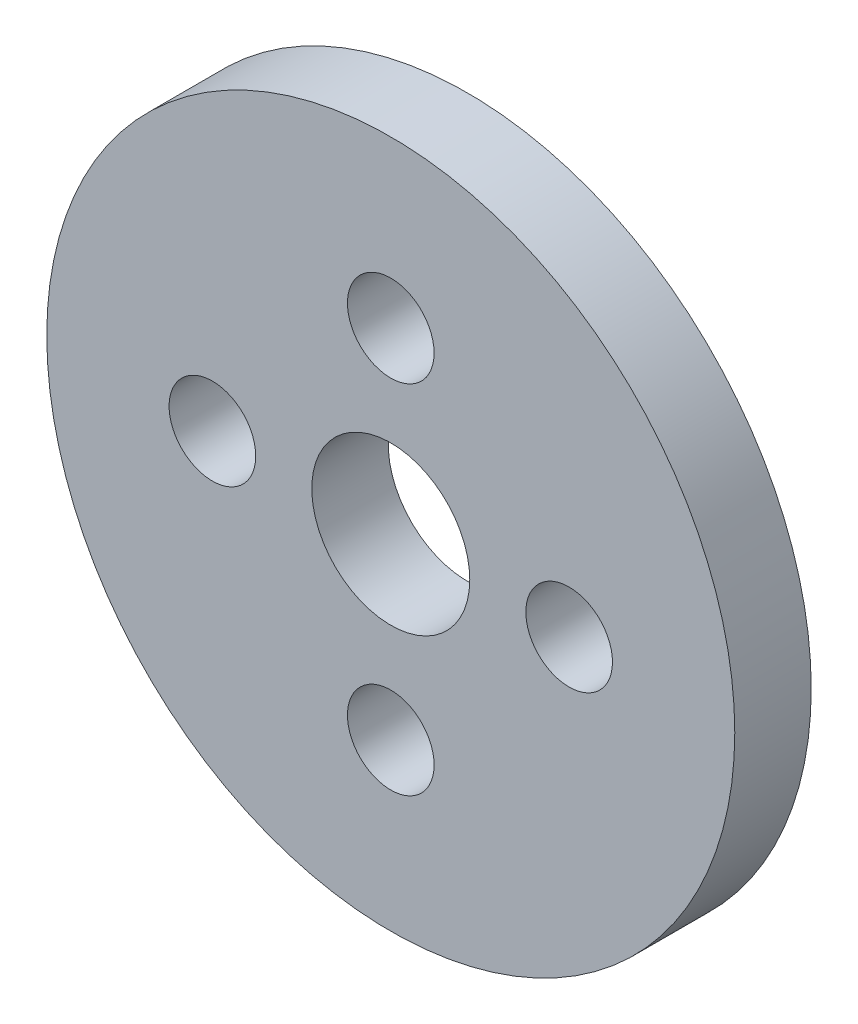
ISO-10303-21;
HEADER;
FILE_DESCRIPTION(('STEP AP214'),'2;1');
FILE_NAME('part.step','',(''),(''),'','','');
FILE_SCHEMA(('AUTOMOTIVE_DESIGN { 1 0 10303 214 1 1 1 1 }'));
ENDSEC;
DATA;
#1=APPLICATION_CONTEXT('core data for automotive mechanical design processes');
#2=APPLICATION_PROTOCOL_DEFINITION('international standard','automotive_design',2000,#1);
#3=PRODUCT_CONTEXT('',#1,'mechanical');
#4=PRODUCT('Part','Part','',(#3));
#5=PRODUCT_RELATED_PRODUCT_CATEGORY('part','',(#4));
#6=PRODUCT_DEFINITION_FORMATION('','',#4);
#7=PRODUCT_DEFINITION_CONTEXT('part definition',#1,'design');
#8=PRODUCT_DEFINITION('design','',#6,#7);
#9=PRODUCT_DEFINITION_SHAPE('','',#8);
#10=(LENGTH_UNIT() NAMED_UNIT(*) SI_UNIT(.MILLI.,.METRE.));
#11=(NAMED_UNIT(*) PLANE_ANGLE_UNIT() SI_UNIT($,.RADIAN.));
#12=(NAMED_UNIT(*) SI_UNIT($,.STERADIAN.) SOLID_ANGLE_UNIT());
#13=UNCERTAINTY_MEASURE_WITH_UNIT(LENGTH_MEASURE(1.E-05),#10,'distance_accuracy_value','');
#14=(GEOMETRIC_REPRESENTATION_CONTEXT(3) GLOBAL_UNCERTAINTY_ASSIGNED_CONTEXT((#13)) GLOBAL_UNIT_ASSIGNED_CONTEXT((#10,
#11,#12)) REPRESENTATION_CONTEXT('',''));
#15=CARTESIAN_POINT('',(0.,0.,0.));
#16=DIRECTION('',(0.,0.,1.));
#17=DIRECTION('',(1.,0.,0.));
#18=AXIS2_PLACEMENT_3D('',#15,#16,#17);
#19=CARTESIAN_POINT('',(0.,7.,-2.));
#20=DIRECTION('',(0.,0.,1.));
#21=DIRECTION('',(1.,0.,0.));
#22=AXIS2_PLACEMENT_3D('',#19,#20,#21);
#23=CYLINDRICAL_SURFACE('',#22,1.7);
#24=CARTESIAN_POINT('',(0.,7.,1.5));
#25=DIRECTION('',(0.,0.,1.));
#26=DIRECTION('',(1.,0.,0.));
#27=AXIS2_PLACEMENT_3D('',#24,#25,#26);
#28=CIRCLE('',#27,1.7);
#29=CARTESIAN_POINT('',(1.7,7.,1.5));
#30=VERTEX_POINT('',#29);
#31=EDGE_CURVE('E35',#30,#30,#28,.T.);
#32=ORIENTED_EDGE('',*,*,#31,.T.);
#33=EDGE_LOOP('',(#32));
#34=FACE_BOUND('',#33,.T.);
#35=CARTESIAN_POINT('',(0.,7.,-1.5));
#36=DIRECTION('',(0.,0.,1.));
#37=DIRECTION('',(1.,0.,0.));
#38=AXIS2_PLACEMENT_3D('',#35,#36,#37);
#39=CIRCLE('',#38,1.7);
#40=CARTESIAN_POINT('',(1.7,7.,-1.5));
#41=VERTEX_POINT('',#40);
#42=EDGE_CURVE('E9',#41,#41,#39,.T.);
#43=ORIENTED_EDGE('',*,*,#42,.F.);
#44=EDGE_LOOP('',(#43));
#45=FACE_BOUND('',#44,.T.);
#46=ADVANCED_FACE('F14',(#34,#45),#23,.F.);
#47=CARTESIAN_POINT('',(7.,0.,-2.));
#48=DIRECTION('',(0.,0.,1.));
#49=DIRECTION('',(1.,0.,0.));
#50=AXIS2_PLACEMENT_3D('',#47,#48,#49);
#51=CYLINDRICAL_SURFACE('',#50,1.7);
#52=CARTESIAN_POINT('',(7.,0.,1.5));
#53=DIRECTION('',(0.,0.,1.));
#54=DIRECTION('',(1.,0.,0.));
#55=AXIS2_PLACEMENT_3D('',#52,#53,#54);
#56=CIRCLE('',#55,1.7);
#57=CARTESIAN_POINT('',(8.7,0.,1.5));
#58=VERTEX_POINT('',#57);
#59=EDGE_CURVE('E40',#58,#58,#56,.T.);
#60=ORIENTED_EDGE('',*,*,#59,.T.);
#61=EDGE_LOOP('',(#60));
#62=FACE_BOUND('',#61,.T.);
#63=CARTESIAN_POINT('',(7.,0.,-1.5));
#64=DIRECTION('',(0.,0.,1.));
#65=DIRECTION('',(1.,0.,0.));
#66=AXIS2_PLACEMENT_3D('',#63,#64,#65);
#67=CIRCLE('',#66,1.7);
#68=CARTESIAN_POINT('',(8.7,0.,-1.5));
#69=VERTEX_POINT('',#68);
#70=EDGE_CURVE('E17',#69,#69,#67,.T.);
#71=ORIENTED_EDGE('',*,*,#70,.F.);
#72=EDGE_LOOP('',(#71));
#73=FACE_BOUND('',#72,.T.);
#74=ADVANCED_FACE('F88',(#62,#73),#51,.F.);
#75=CARTESIAN_POINT('',(0.,0.,-2.));
#76=DIRECTION('',(0.,0.,1.));
#77=DIRECTION('',(1.,0.,0.));
#78=AXIS2_PLACEMENT_3D('',#75,#76,#77);
#79=CYLINDRICAL_SURFACE('',#78,3.1);
#80=CARTESIAN_POINT('',(0.,0.,1.5));
#81=DIRECTION('',(0.,0.,1.));
#82=DIRECTION('',(1.,0.,0.));
#83=AXIS2_PLACEMENT_3D('',#80,#81,#82);
#84=CIRCLE('',#83,3.1);
#85=CARTESIAN_POINT('',(3.1,0.,1.5));
#86=VERTEX_POINT('',#85);
#87=EDGE_CURVE('E57',#86,#86,#84,.T.);
#88=ORIENTED_EDGE('',*,*,#87,.T.);
#89=EDGE_LOOP('',(#88));
#90=FACE_BOUND('',#89,.T.);
#91=CARTESIAN_POINT('',(0.,0.,-1.5));
#92=DIRECTION('',(0.,0.,1.));
#93=DIRECTION('',(1.,0.,0.));
#94=AXIS2_PLACEMENT_3D('',#91,#92,#93);
#95=CIRCLE('',#94,3.1);
#96=CARTESIAN_POINT('',(3.1,0.,-1.5));
#97=VERTEX_POINT('',#96);
#98=EDGE_CURVE('E31',#97,#97,#95,.T.);
#99=ORIENTED_EDGE('',*,*,#98,.F.);
#100=EDGE_LOOP('',(#99));
#101=FACE_BOUND('',#100,.T.);
#102=ADVANCED_FACE('F78',(#90,#101),#79,.F.);
#103=CARTESIAN_POINT('',(-7.,0.,-2.));
#104=DIRECTION('',(0.,0.,1.));
#105=DIRECTION('',(1.,0.,0.));
#106=AXIS2_PLACEMENT_3D('',#103,#104,#105);
#107=CYLINDRICAL_SURFACE('',#106,1.7);
#108=CARTESIAN_POINT('',(-7.,0.,1.5));
#109=DIRECTION('',(0.,0.,1.));
#110=DIRECTION('',(1.,0.,0.));
#111=AXIS2_PLACEMENT_3D('',#108,#109,#110);
#112=CIRCLE('',#111,1.7);
#113=CARTESIAN_POINT('',(-5.3,0.,1.5));
#114=VERTEX_POINT('',#113);
#115=EDGE_CURVE('E53',#114,#114,#112,.T.);
#116=ORIENTED_EDGE('',*,*,#115,.T.);
#117=EDGE_LOOP('',(#116));
#118=FACE_BOUND('',#117,.T.);
#119=CARTESIAN_POINT('',(-7.,0.,-1.5));
#120=DIRECTION('',(0.,0.,1.));
#121=DIRECTION('',(1.,0.,0.));
#122=AXIS2_PLACEMENT_3D('',#119,#120,#121);
#123=CIRCLE('',#122,1.7);
#124=CARTESIAN_POINT('',(-5.3,0.,-1.5));
#125=VERTEX_POINT('',#124);
#126=EDGE_CURVE('E49',#125,#125,#123,.T.);
#127=ORIENTED_EDGE('',*,*,#126,.F.);
#128=EDGE_LOOP('',(#127));
#129=FACE_BOUND('',#128,.T.);
#130=ADVANCED_FACE('F75',(#118,#129),#107,.F.);
#131=CARTESIAN_POINT('',(0.,-7.,-2.));
#132=DIRECTION('',(0.,0.,1.));
#133=DIRECTION('',(1.,0.,0.));
#134=AXIS2_PLACEMENT_3D('',#131,#132,#133);
#135=CYLINDRICAL_SURFACE('',#134,1.7);
#136=CARTESIAN_POINT('',(0.,-7.,1.5));
#137=DIRECTION('',(0.,0.,1.));
#138=DIRECTION('',(1.,0.,0.));
#139=AXIS2_PLACEMENT_3D('',#136,#137,#138);
#140=CIRCLE('',#139,1.7);
#141=CARTESIAN_POINT('',(1.7,-7.,1.5));
#142=VERTEX_POINT('',#141);
#143=EDGE_CURVE('E45',#142,#142,#140,.T.);
#144=ORIENTED_EDGE('',*,*,#143,.T.);
#145=EDGE_LOOP('',(#144));
#146=FACE_BOUND('',#145,.T.);
#147=CARTESIAN_POINT('',(0.,-7.,-1.5));
#148=DIRECTION('',(0.,0.,1.));
#149=DIRECTION('',(1.,0.,0.));
#150=AXIS2_PLACEMENT_3D('',#147,#148,#149);
#151=CIRCLE('',#150,1.7);
#152=CARTESIAN_POINT('',(1.7,-7.,-1.5));
#153=VERTEX_POINT('',#152);
#154=EDGE_CURVE('E39',#153,#153,#151,.T.);
#155=ORIENTED_EDGE('',*,*,#154,.F.);
#156=EDGE_LOOP('',(#155));
#157=FACE_BOUND('',#156,.T.);
#158=ADVANCED_FACE('F77',(#146,#157),#135,.F.);
#159=CARTESIAN_POINT('',(0.,0.,-1.5));
#160=DIRECTION('',(0.,0.,1.));
#161=DIRECTION('',(1.,0.,0.));
#162=AXIS2_PLACEMENT_3D('',#159,#160,#161);
#163=PLANE('',#162);
#164=ORIENTED_EDGE('',*,*,#42,.T.);
#165=EDGE_LOOP('',(#164));
#166=FACE_BOUND('',#165,.T.);
#167=ORIENTED_EDGE('',*,*,#70,.T.);
#168=EDGE_LOOP('',(#167));
#169=FACE_BOUND('',#168,.T.);
#170=ORIENTED_EDGE('',*,*,#98,.T.);
#171=EDGE_LOOP('',(#170));
#172=FACE_BOUND('',#171,.T.);
#173=ORIENTED_EDGE('',*,*,#126,.T.);
#174=EDGE_LOOP('',(#173));
#175=FACE_BOUND('',#174,.T.);
#176=ORIENTED_EDGE('',*,*,#154,.T.);
#177=EDGE_LOOP('',(#176));
#178=FACE_BOUND('',#177,.T.);
#179=CARTESIAN_POINT('',(0.,0.,-1.5));
#180=DIRECTION('',(0.,0.,1.));
#181=DIRECTION('',(1.,0.,0.));
#182=AXIS2_PLACEMENT_3D('',#179,#180,#181);
#183=CIRCLE('',#182,13.5);
#184=CARTESIAN_POINT('',(13.5,0.,-1.5));
#185=VERTEX_POINT('',#184);
#186=EDGE_CURVE('E41',#185,#185,#183,.T.);
#187=ORIENTED_EDGE('',*,*,#186,.F.);
#188=EDGE_LOOP('',(#187));
#189=FACE_BOUND('',#188,.T.);
#190=ADVANCED_FACE('F72',(#166,#169,#172,#175,#178,#189),#163,.F.);
#191=CARTESIAN_POINT('',(0.,0.,1.5));
#192=DIRECTION('',(0.,0.,1.));
#193=DIRECTION('',(1.,0.,0.));
#194=AXIS2_PLACEMENT_3D('',#191,#192,#193);
#195=PLANE('',#194);
#196=ORIENTED_EDGE('',*,*,#31,.F.);
#197=EDGE_LOOP('',(#196));
#198=FACE_BOUND('',#197,.T.);
#199=ORIENTED_EDGE('',*,*,#59,.F.);
#200=EDGE_LOOP('',(#199));
#201=FACE_BOUND('',#200,.T.);
#202=ORIENTED_EDGE('',*,*,#87,.F.);
#203=EDGE_LOOP('',(#202));
#204=FACE_BOUND('',#203,.T.);
#205=ORIENTED_EDGE('',*,*,#115,.F.);
#206=EDGE_LOOP('',(#205));
#207=FACE_BOUND('',#206,.T.);
#208=ORIENTED_EDGE('',*,*,#143,.F.);
#209=EDGE_LOOP('',(#208));
#210=FACE_BOUND('',#209,.T.);
#211=CARTESIAN_POINT('',(0.,0.,1.5));
#212=DIRECTION('',(0.,0.,1.));
#213=DIRECTION('',(1.,0.,0.));
#214=AXIS2_PLACEMENT_3D('',#211,#212,#213);
#215=CIRCLE('',#214,13.5);
#216=CARTESIAN_POINT('',(13.5,0.,1.5));
#217=VERTEX_POINT('',#216);
#218=EDGE_CURVE('E34',#217,#217,#215,.T.);
#219=ORIENTED_EDGE('',*,*,#218,.T.);
#220=EDGE_LOOP('',(#219));
#221=FACE_BOUND('',#220,.T.);
#222=ADVANCED_FACE('F101',(#198,#201,#204,#207,#210,#221),#195,.T.);
#223=CARTESIAN_POINT('',(0.,0.,-1.5));
#224=DIRECTION('',(0.,0.,1.));
#225=DIRECTION('',(1.,0.,0.));
#226=AXIS2_PLACEMENT_3D('',#223,#224,#225);
#227=CYLINDRICAL_SURFACE('',#226,13.5);
#228=ORIENTED_EDGE('',*,*,#218,.F.);
#229=EDGE_LOOP('',(#228));
#230=FACE_BOUND('',#229,.T.);
#231=ORIENTED_EDGE('',*,*,#186,.T.);
#232=EDGE_LOOP('',(#231));
#233=FACE_BOUND('',#232,.T.);
#234=ADVANCED_FACE('F104',(#230,#233),#227,.T.);
#235=CLOSED_SHELL('',(#46,#74,#102,#130,#158,#190,#222,#234));
#236=MANIFOLD_SOLID_BREP('B1',#235);
#237=ADVANCED_BREP_SHAPE_REPRESENTATION('',(#18,#236),#14);
#238=SHAPE_DEFINITION_REPRESENTATION(#9,#237);
ENDSEC;
END-ISO-10303-21;
